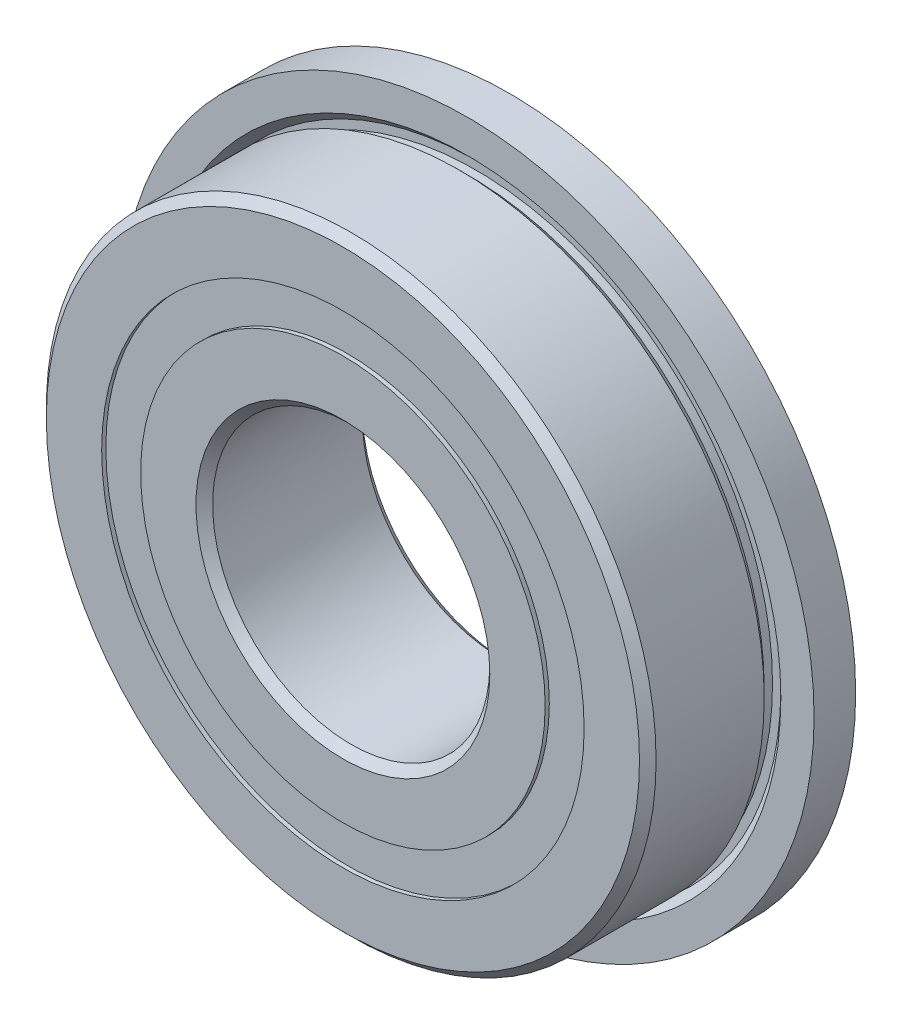
ISO-10303-21;
HEADER;
FILE_DESCRIPTION(('STEP AP214'),'2;1');
FILE_NAME('part.step','',(''),(''),'','','');
FILE_SCHEMA(('AUTOMOTIVE_DESIGN { 1 0 10303 214 1 1 1 1 }'));
ENDSEC;
DATA;
#1=APPLICATION_CONTEXT('core data for automotive mechanical design processes');
#2=APPLICATION_PROTOCOL_DEFINITION('international standard','automotive_design',2000,#1);
#3=PRODUCT_CONTEXT('',#1,'mechanical');
#4=PRODUCT('Part','Part','',(#3));
#5=PRODUCT_RELATED_PRODUCT_CATEGORY('part','',(#4));
#6=PRODUCT_DEFINITION_FORMATION('','',#4);
#7=PRODUCT_DEFINITION_CONTEXT('part definition',#1,'design');
#8=PRODUCT_DEFINITION('design','',#6,#7);
#9=PRODUCT_DEFINITION_SHAPE('','',#8);
#10=(LENGTH_UNIT() NAMED_UNIT(*) SI_UNIT(.MILLI.,.METRE.));
#11=(NAMED_UNIT(*) PLANE_ANGLE_UNIT() SI_UNIT($,.RADIAN.));
#12=(NAMED_UNIT(*) SI_UNIT($,.STERADIAN.) SOLID_ANGLE_UNIT());
#13=UNCERTAINTY_MEASURE_WITH_UNIT(LENGTH_MEASURE(1.E-05),#10,'distance_accuracy_value','');
#14=(GEOMETRIC_REPRESENTATION_CONTEXT(3) GLOBAL_UNCERTAINTY_ASSIGNED_CONTEXT((#13)) GLOBAL_UNIT_ASSIGNED_CONTEXT((#10,
#11,#12)) REPRESENTATION_CONTEXT('',''));
#15=CARTESIAN_POINT('',(0.,0.,0.));
#16=DIRECTION('',(0.,0.,1.));
#17=DIRECTION('',(1.,0.,0.));
#18=AXIS2_PLACEMENT_3D('',#15,#16,#17);
#19=CARTESIAN_POINT('',(0.,8.7032967032967,-2.85000000000001));
#20=DIRECTION('',(0.,0.,1.));
#21=DIRECTION('',(1.,0.,0.));
#22=AXIS2_PLACEMENT_3D('',#19,#20,#21);
#23=PLANE('',#22);
#24=CARTESIAN_POINT('',(0.,0.,-2.85000000000001));
#25=DIRECTION('',(0.,0.,1.));
#26=DIRECTION('',(1.,0.,0.));
#27=AXIS2_PLACEMENT_3D('',#24,#25,#26);
#28=CIRCLE('',#27,8.7032967032967);
#29=CARTESIAN_POINT('',(8.7032967032967,0.,-2.85000000000001));
#30=VERTEX_POINT('',#29);
#31=EDGE_CURVE('E60',#30,#30,#28,.T.);
#32=ORIENTED_EDGE('',*,*,#31,.F.);
#33=EDGE_LOOP('',(#32));
#34=FACE_BOUND('',#33,.T.);
#35=CARTESIAN_POINT('',(0.,0.,-2.85000000000001));
#36=DIRECTION('',(0.,0.,1.));
#37=DIRECTION('',(1.,0.,0.));
#38=AXIS2_PLACEMENT_3D('',#35,#36,#37);
#39=CIRCLE('',#38,7.2967032967033);
#40=CARTESIAN_POINT('',(7.2967032967033,0.,-2.85000000000001));
#41=VERTEX_POINT('',#40);
#42=EDGE_CURVE('E11',#41,#41,#39,.T.);
#43=ORIENTED_EDGE('',*,*,#42,.T.);
#44=EDGE_LOOP('',(#43));
#45=FACE_BOUND('',#44,.T.);
#46=ADVANCED_FACE('F46',(#34,#45),#23,.F.);
#47=CARTESIAN_POINT('',(0.,0.,3.));
#48=DIRECTION('',(0.,0.,1.));
#49=DIRECTION('',(1.,0.,0.));
#50=AXIS2_PLACEMENT_3D('',#47,#48,#49);
#51=CYLINDRICAL_SURFACE('',#50,7.2967032967033);
#52=ORIENTED_EDGE('',*,*,#42,.F.);
#53=EDGE_LOOP('',(#52));
#54=FACE_BOUND('',#53,.T.);
#55=CARTESIAN_POINT('',(0.,0.,-1.50744951180655));
#56=DIRECTION('',(0.,0.,1.));
#57=DIRECTION('',(1.,0.,0.));
#58=AXIS2_PLACEMENT_3D('',#55,#56,#57);
#59=CIRCLE('',#58,7.2967032967033);
#60=CARTESIAN_POINT('',(7.2967032967033,0.,-1.50744951180655));
#61=VERTEX_POINT('',#60);
#62=EDGE_CURVE('E52',#61,#61,#59,.T.);
#63=ORIENTED_EDGE('',*,*,#62,.T.);
#64=EDGE_LOOP('',(#63));
#65=FACE_BOUND('',#64,.T.);
#66=ADVANCED_FACE('F69',(#54,#65),#51,.F.);
#67=CARTESIAN_POINT('',(0.,8.7032967032967,-1.50744951180654));
#68=DIRECTION('',(0.,0.,-1.));
#69=DIRECTION('',(-1.,0.,0.));
#70=AXIS2_PLACEMENT_3D('',#67,#68,#69);
#71=PLANE('',#70);
#72=ORIENTED_EDGE('',*,*,#62,.F.);
#73=EDGE_LOOP('',(#72));
#74=FACE_BOUND('',#73,.T.);
#75=CARTESIAN_POINT('',(0.,0.,-1.50744951180654));
#76=DIRECTION('',(0.,0.,1.));
#77=DIRECTION('',(1.,0.,0.));
#78=AXIS2_PLACEMENT_3D('',#75,#76,#77);
#79=CIRCLE('',#78,8.7032967032967);
#80=CARTESIAN_POINT('',(8.7032967032967,0.,-1.50744951180654));
#81=VERTEX_POINT('',#80);
#82=EDGE_CURVE('E56',#81,#81,#79,.T.);
#83=ORIENTED_EDGE('',*,*,#82,.T.);
#84=EDGE_LOOP('',(#83));
#85=FACE_BOUND('',#84,.T.);
#86=ADVANCED_FACE('F73',(#74,#85),#71,.F.);
#87=CARTESIAN_POINT('',(0.,0.,3.));
#88=DIRECTION('',(0.,0.,1.));
#89=DIRECTION('',(1.,0.,0.));
#90=AXIS2_PLACEMENT_3D('',#87,#88,#89);
#91=CYLINDRICAL_SURFACE('',#90,8.7032967032967);
#92=ORIENTED_EDGE('',*,*,#82,.F.);
#93=EDGE_LOOP('',(#92));
#94=FACE_BOUND('',#93,.T.);
#95=ORIENTED_EDGE('',*,*,#31,.T.);
#96=EDGE_LOOP('',(#95));
#97=FACE_BOUND('',#96,.T.);
#98=ADVANCED_FACE('F66',(#94,#97),#91,.T.);
#99=CLOSED_SHELL('',(#46,#66,#86,#98));
#100=MANIFOLD_SOLID_BREP('B2',#99);
#101=CARTESIAN_POINT('',(0.,8.7032967032967,2.85000000000001));
#102=DIRECTION('',(0.,0.,-1.));
#103=DIRECTION('',(-1.,0.,0.));
#104=AXIS2_PLACEMENT_3D('',#101,#102,#103);
#105=PLANE('',#104);
#106=CARTESIAN_POINT('',(0.,0.,2.85000000000001));
#107=DIRECTION('',(0.,0.,1.));
#108=DIRECTION('',(1.,0.,0.));
#109=AXIS2_PLACEMENT_3D('',#106,#107,#108);
#110=CIRCLE('',#109,7.2967032967033);
#111=CARTESIAN_POINT('',(7.2967032967033,0.,2.85000000000001));
#112=VERTEX_POINT('',#111);
#113=EDGE_CURVE('E45',#112,#112,#110,.T.);
#114=ORIENTED_EDGE('',*,*,#113,.F.);
#115=EDGE_LOOP('',(#114));
#116=FACE_BOUND('',#115,.T.);
#117=CARTESIAN_POINT('',(0.,0.,2.85000000000001));
#118=DIRECTION('',(0.,0.,1.));
#119=DIRECTION('',(1.,0.,0.));
#120=AXIS2_PLACEMENT_3D('',#117,#118,#119);
#121=CIRCLE('',#120,8.7032967032967);
#122=CARTESIAN_POINT('',(8.7032967032967,0.,2.85000000000001));
#123=VERTEX_POINT('',#122);
#124=EDGE_CURVE('E128',#123,#123,#121,.T.);
#125=ORIENTED_EDGE('',*,*,#124,.T.);
#126=EDGE_LOOP('',(#125));
#127=FACE_BOUND('',#126,.T.);
#128=ADVANCED_FACE('F114',(#116,#127),#105,.F.);
#129=CARTESIAN_POINT('',(0.,0.,3.));
#130=DIRECTION('',(0.,0.,1.));
#131=DIRECTION('',(1.,0.,0.));
#132=AXIS2_PLACEMENT_3D('',#129,#130,#131);
#133=CYLINDRICAL_SURFACE('',#132,7.2967032967033);
#134=CARTESIAN_POINT('',(0.,0.,1.50744951180654));
#135=DIRECTION('',(0.,0.,1.));
#136=DIRECTION('',(1.,0.,0.));
#137=AXIS2_PLACEMENT_3D('',#134,#135,#136);
#138=CIRCLE('',#137,7.2967032967033);
#139=CARTESIAN_POINT('',(7.2967032967033,0.,1.50744951180654));
#140=VERTEX_POINT('',#139);
#141=EDGE_CURVE('E120',#140,#140,#138,.T.);
#142=ORIENTED_EDGE('',*,*,#141,.F.);
#143=EDGE_LOOP('',(#142));
#144=FACE_BOUND('',#143,.T.);
#145=ORIENTED_EDGE('',*,*,#113,.T.);
#146=EDGE_LOOP('',(#145));
#147=FACE_BOUND('',#146,.T.);
#148=ADVANCED_FACE('F143',(#144,#147),#133,.F.);
#149=CARTESIAN_POINT('',(0.,8.7032967032967,1.50744951180654));
#150=DIRECTION('',(0.,0.,1.));
#151=DIRECTION('',(1.,0.,0.));
#152=AXIS2_PLACEMENT_3D('',#149,#150,#151);
#153=PLANE('',#152);
#154=CARTESIAN_POINT('',(0.,0.,1.50744951180654));
#155=DIRECTION('',(0.,0.,1.));
#156=DIRECTION('',(1.,0.,0.));
#157=AXIS2_PLACEMENT_3D('',#154,#155,#156);
#158=CIRCLE('',#157,8.7032967032967);
#159=CARTESIAN_POINT('',(8.7032967032967,0.,1.50744951180654));
#160=VERTEX_POINT('',#159);
#161=EDGE_CURVE('E124',#160,#160,#158,.T.);
#162=ORIENTED_EDGE('',*,*,#161,.F.);
#163=EDGE_LOOP('',(#162));
#164=FACE_BOUND('',#163,.T.);
#165=ORIENTED_EDGE('',*,*,#141,.T.);
#166=EDGE_LOOP('',(#165));
#167=FACE_BOUND('',#166,.T.);
#168=ADVANCED_FACE('F138',(#164,#167),#153,.F.);
#169=CARTESIAN_POINT('',(0.,0.,3.));
#170=DIRECTION('',(0.,0.,1.));
#171=DIRECTION('',(1.,0.,0.));
#172=AXIS2_PLACEMENT_3D('',#169,#170,#171);
#173=CYLINDRICAL_SURFACE('',#172,8.7032967032967);
#174=ORIENTED_EDGE('',*,*,#124,.F.);
#175=EDGE_LOOP('',(#174));
#176=FACE_BOUND('',#175,.T.);
#177=ORIENTED_EDGE('',*,*,#161,.T.);
#178=EDGE_LOOP('',(#177));
#179=FACE_BOUND('',#178,.T.);
#180=ADVANCED_FACE('F135',(#176,#179),#173,.T.);
#181=CLOSED_SHELL('',(#128,#148,#168,#180));
#182=MANIFOLD_SOLID_BREP('B6',#181);
#183=CARTESIAN_POINT('',(-4.7022820183397,6.47213595499964,0.));
#184=DIRECTION('',(0.,0.,1.));
#185=DIRECTION('',(-0.587785252292462,0.809016994374955,0.));
#186=AXIS2_PLACEMENT_3D('',#183,#184,#185);
#187=SPHERICAL_SURFACE('',#186,1.50744951180654);
#188=CARTESIAN_POINT('',(-4.7022820183397,6.47213595499964,1.50744951180654));
#189=VERTEX_POINT('',#188);
#190=VERTEX_LOOP('',#189);
#191=FACE_BOUND('',#190,.T.);
#192=ADVANCED_FACE('F182',(#191),#187,.T.);
#193=CLOSED_SHELL('',(#192));
#194=MANIFOLD_SOLID_BREP('B40',#193);
#195=CARTESIAN_POINT('',(-7.6084521303612,2.47213595499967,0.));
#196=DIRECTION('',(0.,0.,1.));
#197=DIRECTION('',(-0.95105651629515,0.309016994374958,0.));
#198=AXIS2_PLACEMENT_3D('',#195,#196,#197);
#199=SPHERICAL_SURFACE('',#198,1.50744951180654);
#200=CARTESIAN_POINT('',(-7.6084521303612,2.47213595499967,1.50744951180654));
#201=VERTEX_POINT('',#200);
#202=VERTEX_LOOP('',#201);
#203=FACE_BOUND('',#202,.T.);
#204=ADVANCED_FACE('F203',(#203),#199,.T.);
#205=CLOSED_SHELL('',(#204));
#206=MANIFOLD_SOLID_BREP('B110',#205);
#207=CARTESIAN_POINT('',(-7.60845213036125,-2.47213595499951,0.));
#208=DIRECTION('',(0.,0.,1.));
#209=DIRECTION('',(-0.951056516295157,-0.309016994374938,0.));
#210=AXIS2_PLACEMENT_3D('',#207,#208,#209);
#211=SPHERICAL_SURFACE('',#210,1.50744951180654);
#212=CARTESIAN_POINT('',(-7.60845213036125,-2.47213595499951,1.50744951180654));
#213=VERTEX_POINT('',#212);
#214=VERTEX_LOOP('',#213);
#215=FACE_BOUND('',#214,.T.);
#216=ADVANCED_FACE('F224',(#215),#211,.T.);
#217=CLOSED_SHELL('',(#216));
#218=MANIFOLD_SOLID_BREP('B178',#217);
#219=CARTESIAN_POINT('',(-4.70228201833984,-6.47213595499954,0.));
#220=DIRECTION('',(0.,0.,1.));
#221=DIRECTION('',(-0.58778525229248,-0.809016994374942,0.));
#222=AXIS2_PLACEMENT_3D('',#219,#220,#221);
#223=SPHERICAL_SURFACE('',#222,1.50744951180654);
#224=CARTESIAN_POINT('',(-4.70228201833984,-6.47213595499954,1.50744951180654));
#225=VERTEX_POINT('',#224);
#226=VERTEX_LOOP('',#225);
#227=FACE_BOUND('',#226,.T.);
#228=ADVANCED_FACE('F245',(#227),#223,.T.);
#229=CLOSED_SHELL('',(#228));
#230=MANIFOLD_SOLID_BREP('B199',#229);
#231=CARTESIAN_POINT('',(0.,-8.,0.));
#232=DIRECTION('',(0.,0.,1.));
#233=DIRECTION('',(0.,-1.,0.));
#234=AXIS2_PLACEMENT_3D('',#231,#232,#233);
#235=SPHERICAL_SURFACE('',#234,1.50744951180654);
#236=CARTESIAN_POINT('',(0.,-8.,1.50744951180654));
#237=VERTEX_POINT('',#236);
#238=VERTEX_LOOP('',#237);
#239=FACE_BOUND('',#238,.T.);
#240=ADVANCED_FACE('F266',(#239),#235,.T.);
#241=CLOSED_SHELL('',(#240));
#242=MANIFOLD_SOLID_BREP('B220',#241);
#243=CARTESIAN_POINT('',(4.70228201833975,-6.47213595499961,0.));
#244=DIRECTION('',(0.,0.,1.));
#245=DIRECTION('',(0.587785252292469,-0.809016994374951,0.));
#246=AXIS2_PLACEMENT_3D('',#243,#244,#245);
#247=SPHERICAL_SURFACE('',#246,1.50744951180654);
#248=CARTESIAN_POINT('',(4.70228201833975,-6.47213595499961,1.50744951180654));
#249=VERTEX_POINT('',#248);
#250=VERTEX_LOOP('',#249);
#251=FACE_BOUND('',#250,.T.);
#252=ADVANCED_FACE('F287',(#251),#247,.T.);
#253=CLOSED_SHELL('',(#252));
#254=MANIFOLD_SOLID_BREP('B241',#253);
#255=CARTESIAN_POINT('',(7.60845213036122,-2.47213595499961,0.));
#256=DIRECTION('',(0.,0.,1.));
#257=DIRECTION('',(0.951056516295152,-0.309016994374952,0.));
#258=AXIS2_PLACEMENT_3D('',#255,#256,#257);
#259=SPHERICAL_SURFACE('',#258,1.50744951180654);
#260=CARTESIAN_POINT('',(7.60845213036122,-2.47213595499961,1.50744951180654));
#261=VERTEX_POINT('',#260);
#262=VERTEX_LOOP('',#261);
#263=FACE_BOUND('',#262,.T.);
#264=ADVANCED_FACE('F308',(#263),#259,.T.);
#265=CLOSED_SHELL('',(#264));
#266=MANIFOLD_SOLID_BREP('B262',#265);
#267=CARTESIAN_POINT('',(7.60845213036124,2.47213595499956,0.));
#268=DIRECTION('',(0.,0.,1.));
#269=DIRECTION('',(0.951056516295155,0.309016994374945,0.));
#270=AXIS2_PLACEMENT_3D('',#267,#268,#269);
#271=SPHERICAL_SURFACE('',#270,1.50744951180654);
#272=CARTESIAN_POINT('',(7.60845213036124,2.47213595499956,1.50744951180654));
#273=VERTEX_POINT('',#272);
#274=VERTEX_LOOP('',#273);
#275=FACE_BOUND('',#274,.T.);
#276=ADVANCED_FACE('F329',(#275),#271,.T.);
#277=CLOSED_SHELL('',(#276));
#278=MANIFOLD_SOLID_BREP('B283',#277);
#279=CARTESIAN_POINT('',(4.70228201833979,6.47213595499957,0.));
#280=DIRECTION('',(0.,0.,1.));
#281=DIRECTION('',(0.587785252292474,0.809016994374947,0.));
#282=AXIS2_PLACEMENT_3D('',#279,#280,#281);
#283=SPHERICAL_SURFACE('',#282,1.50744951180654);
#284=CARTESIAN_POINT('',(4.70228201833979,6.47213595499957,1.50744951180654));
#285=VERTEX_POINT('',#284);
#286=VERTEX_LOOP('',#285);
#287=FACE_BOUND('',#286,.T.);
#288=ADVANCED_FACE('F350',(#287),#283,.T.);
#289=CLOSED_SHELL('',(#288));
#290=MANIFOLD_SOLID_BREP('B304',#289);
#291=CARTESIAN_POINT('',(0.,8.,0.));
#292=DIRECTION('',(0.,0.,1.));
#293=DIRECTION('',(0.,1.,0.));
#294=AXIS2_PLACEMENT_3D('',#291,#292,#293);
#295=SPHERICAL_SURFACE('',#294,1.50744951180654);
#296=CARTESIAN_POINT('',(0.,8.,1.50744951180654));
#297=VERTEX_POINT('',#296);
#298=VERTEX_LOOP('',#297);
#299=FACE_BOUND('',#298,.T.);
#300=ADVANCED_FACE('F373',(#299),#295,.T.);
#301=CLOSED_SHELL('',(#300));
#302=MANIFOLD_SOLID_BREP('B325',#301);
#303=CARTESIAN_POINT('',(0.,8.35164835164835,0.117216117216116));
#304=DIRECTION('',(0.,0.,-1.));
#305=DIRECTION('',(-1.,0.,0.));
#306=AXIS2_PLACEMENT_3D('',#303,#304,#305);
#307=PLANE('',#306);
#308=CARTESIAN_POINT('',(0.,0.,0.117216117216116));
#309=DIRECTION('',(0.,0.,1.));
#310=DIRECTION('',(1.,0.,0.));
#311=AXIS2_PLACEMENT_3D('',#308,#309,#310);
#312=CIRCLE('',#311,7.64835164835165);
#313=CARTESIAN_POINT('',(7.64835164835165,0.,0.117216117216116));
#314=VERTEX_POINT('',#313);
#315=EDGE_CURVE('E372',#314,#314,#312,.T.);
#316=ORIENTED_EDGE('',*,*,#315,.F.);
#317=EDGE_LOOP('',(#316));
#318=FACE_BOUND('',#317,.T.);
#319=CARTESIAN_POINT('',(0.,0.,0.117216117216116));
#320=DIRECTION('',(0.,0.,1.));
#321=DIRECTION('',(1.,0.,0.));
#322=AXIS2_PLACEMENT_3D('',#319,#320,#321);
#323=CIRCLE('',#322,8.35164835164835);
#324=CARTESIAN_POINT('',(8.35164835164835,0.,0.117216117216116));
#325=VERTEX_POINT('',#324);
#326=EDGE_CURVE('E408',#325,#325,#323,.T.);
#327=ORIENTED_EDGE('',*,*,#326,.T.);
#328=EDGE_LOOP('',(#327));
#329=FACE_BOUND('',#328,.T.);
#330=ADVANCED_FACE('F394',(#318,#329),#307,.F.);
#331=CARTESIAN_POINT('',(0.,0.,3.));
#332=DIRECTION('',(0.,0.,1.));
#333=DIRECTION('',(1.,0.,0.));
#334=AXIS2_PLACEMENT_3D('',#331,#332,#333);
#335=CYLINDRICAL_SURFACE('',#334,7.64835164835165);
#336=CARTESIAN_POINT('',(0.,0.,-0.117216117216118));
#337=DIRECTION('',(0.,0.,1.));
#338=DIRECTION('',(1.,0.,0.));
#339=AXIS2_PLACEMENT_3D('',#336,#337,#338);
#340=CIRCLE('',#339,7.64835164835165);
#341=CARTESIAN_POINT('',(7.64835164835165,0.,-0.117216117216118));
#342=VERTEX_POINT('',#341);
#343=EDGE_CURVE('E400',#342,#342,#340,.T.);
#344=ORIENTED_EDGE('',*,*,#343,.F.);
#345=EDGE_LOOP('',(#344));
#346=FACE_BOUND('',#345,.T.);
#347=ORIENTED_EDGE('',*,*,#315,.T.);
#348=EDGE_LOOP('',(#347));
#349=FACE_BOUND('',#348,.T.);
#350=ADVANCED_FACE('F423',(#346,#349),#335,.F.);
#351=CARTESIAN_POINT('',(0.,8.35164835164835,-0.117216117216118));
#352=DIRECTION('',(0.,0.,1.));
#353=DIRECTION('',(1.,0.,0.));
#354=AXIS2_PLACEMENT_3D('',#351,#352,#353);
#355=PLANE('',#354);
#356=CARTESIAN_POINT('',(0.,0.,-0.117216117216118));
#357=DIRECTION('',(0.,0.,1.));
#358=DIRECTION('',(1.,0.,0.));
#359=AXIS2_PLACEMENT_3D('',#356,#357,#358);
#360=CIRCLE('',#359,8.35164835164835);
#361=CARTESIAN_POINT('',(8.35164835164835,0.,-0.117216117216118));
#362=VERTEX_POINT('',#361);
#363=EDGE_CURVE('E404',#362,#362,#360,.T.);
#364=ORIENTED_EDGE('',*,*,#363,.F.);
#365=EDGE_LOOP('',(#364));
#366=FACE_BOUND('',#365,.T.);
#367=ORIENTED_EDGE('',*,*,#343,.T.);
#368=EDGE_LOOP('',(#367));
#369=FACE_BOUND('',#368,.T.);
#370=ADVANCED_FACE('F418',(#366,#369),#355,.F.);
#371=CARTESIAN_POINT('',(0.,0.,3.));
#372=DIRECTION('',(0.,0.,1.));
#373=DIRECTION('',(1.,0.,0.));
#374=AXIS2_PLACEMENT_3D('',#371,#372,#373);
#375=CYLINDRICAL_SURFACE('',#374,8.35164835164835);
#376=ORIENTED_EDGE('',*,*,#326,.F.);
#377=EDGE_LOOP('',(#376));
#378=FACE_BOUND('',#377,.T.);
#379=ORIENTED_EDGE('',*,*,#363,.T.);
#380=EDGE_LOOP('',(#379));
#381=FACE_BOUND('',#380,.T.);
#382=ADVANCED_FACE('F415',(#378,#381),#375,.T.);
#383=CLOSED_SHELL('',(#330,#350,#370,#382));
#384=MANIFOLD_SOLID_BREP('B346',#383);
#385=CARTESIAN_POINT('',(0.,7.2967032967033,3.));
#386=DIRECTION('',(0.,0.,-1.));
#387=DIRECTION('',(-1.,0.,0.));
#388=AXIS2_PLACEMENT_3D('',#385,#386,#387);
#389=PLANE('',#388);
#390=CARTESIAN_POINT('',(0.,0.,3.));
#391=DIRECTION('',(0.,0.,1.));
#392=DIRECTION('',(1.,0.,0.));
#393=AXIS2_PLACEMENT_3D('',#390,#391,#392);
#394=CIRCLE('',#393,5.29999999999998);
#395=CARTESIAN_POINT('',(5.29999999999998,0.,3.));
#396=VERTEX_POINT('',#395);
#397=EDGE_CURVE('E491',#396,#396,#394,.T.);
#398=ORIENTED_EDGE('',*,*,#397,.F.);
#399=EDGE_LOOP('',(#398));
#400=FACE_BOUND('',#399,.T.);
#401=CARTESIAN_POINT('',(0.,0.,3.));
#402=DIRECTION('',(0.,0.,1.));
#403=DIRECTION('',(1.,0.,0.));
#404=AXIS2_PLACEMENT_3D('',#401,#402,#403);
#405=CIRCLE('',#404,7.2967032967033);
#406=CARTESIAN_POINT('',(7.2967032967033,0.,3.));
#407=VERTEX_POINT('',#406);
#408=EDGE_CURVE('E393',#407,#407,#405,.T.);
#409=ORIENTED_EDGE('',*,*,#408,.T.);
#410=EDGE_LOOP('',(#409));
#411=FACE_BOUND('',#410,.T.);
#412=ADVANCED_FACE('F463',(#400,#411),#389,.F.);
#413=CARTESIAN_POINT('',(0.,0.,3.));
#414=DIRECTION('',(0.,0.,1.));
#415=DIRECTION('',(1.,0.,0.));
#416=AXIS2_PLACEMENT_3D('',#413,#414,#415);
#417=CYLINDRICAL_SURFACE('',#416,7.2967032967033);
#418=ORIENTED_EDGE('',*,*,#408,.F.);
#419=EDGE_LOOP('',(#418));
#420=FACE_BOUND('',#419,.T.);
#421=CARTESIAN_POINT('',(0.,0.,1.33333333333333));
#422=DIRECTION('',(0.,0.,1.));
#423=DIRECTION('',(1.,0.,0.));
#424=AXIS2_PLACEMENT_3D('',#421,#422,#423);
#425=CIRCLE('',#424,7.2967032967033);
#426=CARTESIAN_POINT('',(7.2967032967033,0.,1.33333333333333));
#427=VERTEX_POINT('',#426);
#428=EDGE_CURVE('E469',#427,#427,#425,.T.);
#429=ORIENTED_EDGE('',*,*,#428,.T.);
#430=EDGE_LOOP('',(#429));
#431=FACE_BOUND('',#430,.T.);
#432=ADVANCED_FACE('F498',(#420,#431),#417,.T.);
#433=CARTESIAN_POINT('',(0.,0.,0.));
#434=DIRECTION('',(0.,0.,1.));
#435=DIRECTION('',(1.,0.,0.));
#436=AXIS2_PLACEMENT_3D('',#433,#434,#435);
#437=TOROIDAL_SURFACE('',#436,8.,1.50744951180654);
#438=ORIENTED_EDGE('',*,*,#428,.F.);
#439=EDGE_LOOP('',(#438));
#440=FACE_BOUND('',#439,.T.);
#441=CARTESIAN_POINT('',(0.,0.,-1.33333333333333));
#442=DIRECTION('',(0.,0.,1.));
#443=DIRECTION('',(1.,0.,0.));
#444=AXIS2_PLACEMENT_3D('',#441,#442,#443);
#445=CIRCLE('',#444,7.2967032967033);
#446=CARTESIAN_POINT('',(7.2967032967033,0.,-1.33333333333333));
#447=VERTEX_POINT('',#446);
#448=EDGE_CURVE('E473',#447,#447,#445,.T.);
#449=ORIENTED_EDGE('',*,*,#448,.T.);
#450=EDGE_LOOP('',(#449));
#451=FACE_BOUND('',#450,.T.);
#452=ADVANCED_FACE('F502',(#440,#451),#437,.F.);
#453=CARTESIAN_POINT('',(0.,0.,3.));
#454=DIRECTION('',(0.,0.,1.));
#455=DIRECTION('',(1.,0.,0.));
#456=AXIS2_PLACEMENT_3D('',#453,#454,#455);
#457=CYLINDRICAL_SURFACE('',#456,7.2967032967033);
#458=ORIENTED_EDGE('',*,*,#448,.F.);
#459=EDGE_LOOP('',(#458));
#460=FACE_BOUND('',#459,.T.);
#461=CARTESIAN_POINT('',(0.,0.,-3.));
#462=DIRECTION('',(0.,0.,1.));
#463=DIRECTION('',(1.,0.,0.));
#464=AXIS2_PLACEMENT_3D('',#461,#462,#463);
#465=CIRCLE('',#464,7.2967032967033);
#466=CARTESIAN_POINT('',(7.2967032967033,0.,-3.));
#467=VERTEX_POINT('',#466);
#468=EDGE_CURVE('E477',#467,#467,#465,.T.);
#469=ORIENTED_EDGE('',*,*,#468,.T.);
#470=EDGE_LOOP('',(#469));
#471=FACE_BOUND('',#470,.T.);
#472=ADVANCED_FACE('F507',(#460,#471),#457,.T.);
#473=CARTESIAN_POINT('',(0.,5.29999999999998,-3.));
#474=DIRECTION('',(0.,0.,1.));
#475=DIRECTION('',(1.,0.,0.));
#476=AXIS2_PLACEMENT_3D('',#473,#474,#475);
#477=PLANE('',#476);
#478=ORIENTED_EDGE('',*,*,#468,.F.);
#479=EDGE_LOOP('',(#478));
#480=FACE_BOUND('',#479,.T.);
#481=CARTESIAN_POINT('',(0.,0.,-3.));
#482=DIRECTION('',(0.,0.,1.));
#483=DIRECTION('',(1.,0.,0.));
#484=AXIS2_PLACEMENT_3D('',#481,#482,#483);
#485=CIRCLE('',#484,5.29999999999998);
#486=CARTESIAN_POINT('',(5.29999999999998,0.,-3.));
#487=VERTEX_POINT('',#486);
#488=EDGE_CURVE('E482',#487,#487,#485,.T.);
#489=ORIENTED_EDGE('',*,*,#488,.T.);
#490=EDGE_LOOP('',(#489));
#491=FACE_BOUND('',#490,.T.);
#492=ADVANCED_FACE('F513',(#480,#491),#477,.F.);
#493=CARTESIAN_POINT('',(0.,0.,-2.70000000000002));
#494=DIRECTION('',(0.,0.,-1.));
#495=DIRECTION('',(-1.,0.,0.));
#496=AXIS2_PLACEMENT_3D('',#493,#494,#495);
#497=CONICAL_SURFACE('',#496,5.,0.785398163397453);
#498=ORIENTED_EDGE('',*,*,#488,.F.);
#499=EDGE_LOOP('',(#498));
#500=FACE_BOUND('',#499,.T.);
#501=CARTESIAN_POINT('',(0.,0.,-2.70000000000002));
#502=DIRECTION('',(0.,0.,1.));
#503=DIRECTION('',(1.,0.,0.));
#504=AXIS2_PLACEMENT_3D('',#501,#502,#503);
#505=CIRCLE('',#504,5.);
#506=CARTESIAN_POINT('',(5.,0.,-2.70000000000002));
#507=VERTEX_POINT('',#506);
#508=EDGE_CURVE('E485',#507,#507,#505,.T.);
#509=ORIENTED_EDGE('',*,*,#508,.T.);
#510=EDGE_LOOP('',(#509));
#511=FACE_BOUND('',#510,.T.);
#512=ADVANCED_FACE('F517',(#500,#511),#497,.F.);
#513=CARTESIAN_POINT('',(0.,0.,3.));
#514=DIRECTION('',(0.,0.,1.));
#515=DIRECTION('',(1.,0.,0.));
#516=AXIS2_PLACEMENT_3D('',#513,#514,#515);
#517=CYLINDRICAL_SURFACE('',#516,5.);
#518=ORIENTED_EDGE('',*,*,#508,.F.);
#519=EDGE_LOOP('',(#518));
#520=FACE_BOUND('',#519,.T.);
#521=CARTESIAN_POINT('',(0.,0.,2.70000000000002));
#522=DIRECTION('',(0.,0.,1.));
#523=DIRECTION('',(1.,0.,0.));
#524=AXIS2_PLACEMENT_3D('',#521,#522,#523);
#525=CIRCLE('',#524,5.);
#526=CARTESIAN_POINT('',(5.,0.,2.70000000000002));
#527=VERTEX_POINT('',#526);
#528=EDGE_CURVE('E488',#527,#527,#525,.T.);
#529=ORIENTED_EDGE('',*,*,#528,.T.);
#530=EDGE_LOOP('',(#529));
#531=FACE_BOUND('',#530,.T.);
#532=ADVANCED_FACE('F521',(#520,#531),#517,.F.);
#533=CARTESIAN_POINT('',(0.,0.,3.));
#534=DIRECTION('',(0.,0.,1.));
#535=DIRECTION('',(1.,0.,0.));
#536=AXIS2_PLACEMENT_3D('',#533,#534,#535);
#537=CONICAL_SURFACE('',#536,5.29999999999998,0.785398163397445);
#538=ORIENTED_EDGE('',*,*,#528,.F.);
#539=EDGE_LOOP('',(#538));
#540=FACE_BOUND('',#539,.T.);
#541=ORIENTED_EDGE('',*,*,#397,.T.);
#542=EDGE_LOOP('',(#541));
#543=FACE_BOUND('',#542,.T.);
#544=ADVANCED_FACE('F495',(#540,#543),#537,.F.);
#545=CLOSED_SHELL('',(#412,#432,#452,#472,#492,#512,#532,#544));
#546=MANIFOLD_SOLID_BREP('B367',#545);
#547=CARTESIAN_POINT('',(0.,0.,3.));
#548=DIRECTION('',(0.,0.,1.));
#549=DIRECTION('',(1.,0.,0.));
#550=AXIS2_PLACEMENT_3D('',#547,#548,#549);
#551=CYLINDRICAL_SURFACE('',#550,12.5);
#552=CARTESIAN_POINT('',(0.,0.,-1.5));
#553=DIRECTION('',(0.,0.,1.));
#554=DIRECTION('',(1.,0.,0.));
#555=AXIS2_PLACEMENT_3D('',#552,#553,#554);
#556=CIRCLE('',#555,12.5);
#557=CARTESIAN_POINT('',(12.5,0.,-1.5));
#558=VERTEX_POINT('',#557);
#559=EDGE_CURVE('E591',#558,#558,#556,.T.);
#560=ORIENTED_EDGE('',*,*,#559,.F.);
#561=EDGE_LOOP('',(#560));
#562=FACE_BOUND('',#561,.T.);
#563=CARTESIAN_POINT('',(0.,0.,-2.99999999999999));
#564=DIRECTION('',(0.,0.,1.));
#565=DIRECTION('',(1.,0.,0.));
#566=AXIS2_PLACEMENT_3D('',#563,#564,#565);
#567=CIRCLE('',#566,12.5);
#568=CARTESIAN_POINT('',(12.5,0.,-2.99999999999999));
#569=VERTEX_POINT('',#568);
#570=EDGE_CURVE('E462',#569,#569,#567,.T.);
#571=ORIENTED_EDGE('',*,*,#570,.T.);
#572=EDGE_LOOP('',(#571));
#573=FACE_BOUND('',#572,.T.);
#574=ADVANCED_FACE('F585',(#562,#573),#551,.T.);
#575=CARTESIAN_POINT('',(0.,12.5,-1.5));
#576=DIRECTION('',(0.,0.,-1.));
#577=DIRECTION('',(-1.,0.,0.));
#578=AXIS2_PLACEMENT_3D('',#575,#576,#577);
#579=PLANE('',#578);
#580=CARTESIAN_POINT('',(0.,0.,-1.5));
#581=DIRECTION('',(0.,0.,1.));
#582=DIRECTION('',(1.,0.,0.));
#583=AXIS2_PLACEMENT_3D('',#580,#581,#582);
#584=CIRCLE('',#583,11.3);
#585=CARTESIAN_POINT('',(11.3,0.,-1.5));
#586=VERTEX_POINT('',#585);
#587=EDGE_CURVE('E595',#586,#586,#584,.T.);
#588=ORIENTED_EDGE('',*,*,#587,.F.);
#589=EDGE_LOOP('',(#588));
#590=FACE_BOUND('',#589,.T.);
#591=ORIENTED_EDGE('',*,*,#559,.T.);
#592=EDGE_LOOP('',(#591));
#593=FACE_BOUND('',#592,.T.);
#594=ADVANCED_FACE('F691',(#590,#593),#579,.F.);
#595=CARTESIAN_POINT('',(0.,0.,-1.5));
#596=DIRECTION('',(0.,0.,1.));
#597=DIRECTION('',(1.,0.,0.));
#598=AXIS2_PLACEMENT_3D('',#595,#596,#597);
#599=CONICAL_SURFACE('',#598,11.3,0.785398163397437);
#600=CARTESIAN_POINT('',(0.,0.,-1.79999999999998));
#601=DIRECTION('',(0.,0.,1.));
#602=DIRECTION('',(1.,0.,0.));
#603=AXIS2_PLACEMENT_3D('',#600,#601,#602);
#604=CIRCLE('',#603,11.);
#605=CARTESIAN_POINT('',(11.,0.,-1.79999999999998));
#606=VERTEX_POINT('',#605);
#607=EDGE_CURVE('E599',#606,#606,#604,.T.);
#608=ORIENTED_EDGE('',*,*,#607,.F.);
#609=EDGE_LOOP('',(#608));
#610=FACE_BOUND('',#609,.T.);
#611=ORIENTED_EDGE('',*,*,#587,.T.);
#612=EDGE_LOOP('',(#611));
#613=FACE_BOUND('',#612,.T.);
#614=ADVANCED_FACE('F685',(#610,#613),#599,.F.);
#615=CARTESIAN_POINT('',(0.,11.,-1.79999999999998));
#616=DIRECTION('',(0.,0.,-1.));
#617=DIRECTION('',(-1.,0.,0.));
#618=AXIS2_PLACEMENT_3D('',#615,#616,#617);
#619=PLANE('',#618);
#620=CARTESIAN_POINT('',(0.,0.,-1.79999999999998));
#621=DIRECTION('',(0.,0.,1.));
#622=DIRECTION('',(1.,0.,0.));
#623=AXIS2_PLACEMENT_3D('',#620,#621,#622);
#624=CIRCLE('',#623,10.7);
#625=CARTESIAN_POINT('',(10.7,0.,-1.79999999999998));
#626=VERTEX_POINT('',#625);
#627=EDGE_CURVE('E604',#626,#626,#624,.T.);
#628=ORIENTED_EDGE('',*,*,#627,.F.);
#629=EDGE_LOOP('',(#628));
#630=FACE_BOUND('',#629,.T.);
#631=ORIENTED_EDGE('',*,*,#607,.T.);
#632=EDGE_LOOP('',(#631));
#633=FACE_BOUND('',#632,.T.);
#634=ADVANCED_FACE('F679',(#630,#633),#619,.F.);
#635=CARTESIAN_POINT('',(0.,0.,3.));
#636=DIRECTION('',(0.,0.,1.));
#637=DIRECTION('',(1.,0.,0.));
#638=AXIS2_PLACEMENT_3D('',#635,#636,#637);
#639=CYLINDRICAL_SURFACE('',#638,10.7);
#640=CARTESIAN_POINT('',(0.,0.,-1.5));
#641=DIRECTION('',(0.,0.,1.));
#642=DIRECTION('',(1.,0.,0.));
#643=AXIS2_PLACEMENT_3D('',#640,#641,#642);
#644=CIRCLE('',#643,10.7);
#645=CARTESIAN_POINT('',(10.7,0.,-1.5));
#646=VERTEX_POINT('',#645);
#647=EDGE_CURVE('E607',#646,#646,#644,.T.);
#648=ORIENTED_EDGE('',*,*,#647,.F.);
#649=EDGE_LOOP('',(#648));
#650=FACE_BOUND('',#649,.T.);
#651=ORIENTED_EDGE('',*,*,#627,.T.);
#652=EDGE_LOOP('',(#651));
#653=FACE_BOUND('',#652,.T.);
#654=ADVANCED_FACE('F673',(#650,#653),#639,.T.);
#655=CARTESIAN_POINT('',(0.,0.,-1.5));
#656=DIRECTION('',(0.,0.,1.));
#657=DIRECTION('',(1.,0.,0.));
#658=AXIS2_PLACEMENT_3D('',#655,#656,#657);
#659=CONICAL_SURFACE('',#658,10.7,0.785398163397447);
#660=CARTESIAN_POINT('',(0.,0.,-1.20000000000002));
#661=DIRECTION('',(0.,0.,1.));
#662=DIRECTION('',(1.,0.,0.));
#663=AXIS2_PLACEMENT_3D('',#660,#661,#662);
#664=CIRCLE('',#663,11.);
#665=CARTESIAN_POINT('',(11.,0.,-1.20000000000002));
#666=VERTEX_POINT('',#665);
#667=EDGE_CURVE('E610',#666,#666,#664,.T.);
#668=ORIENTED_EDGE('',*,*,#667,.F.);
#669=EDGE_LOOP('',(#668));
#670=FACE_BOUND('',#669,.T.);
#671=ORIENTED_EDGE('',*,*,#647,.T.);
#672=EDGE_LOOP('',(#671));
#673=FACE_BOUND('',#672,.T.);
#674=ADVANCED_FACE('F667',(#670,#673),#659,.T.);
#675=CARTESIAN_POINT('',(0.,0.,3.));
#676=DIRECTION('',(0.,0.,1.));
#677=DIRECTION('',(1.,0.,0.));
#678=AXIS2_PLACEMENT_3D('',#675,#676,#677);
#679=CYLINDRICAL_SURFACE('',#678,11.);
#680=CARTESIAN_POINT('',(0.,0.,2.70000000000002));
#681=DIRECTION('',(0.,0.,1.));
#682=DIRECTION('',(1.,0.,0.));
#683=AXIS2_PLACEMENT_3D('',#680,#681,#682);
#684=CIRCLE('',#683,11.);
#685=CARTESIAN_POINT('',(11.,0.,2.70000000000002));
#686=VERTEX_POINT('',#685);
#687=EDGE_CURVE('E613',#686,#686,#684,.T.);
#688=ORIENTED_EDGE('',*,*,#687,.F.);
#689=EDGE_LOOP('',(#688));
#690=FACE_BOUND('',#689,.T.);
#691=ORIENTED_EDGE('',*,*,#667,.T.);
#692=EDGE_LOOP('',(#691));
#693=FACE_BOUND('',#692,.T.);
#694=ADVANCED_FACE('F661',(#690,#693),#679,.T.);
#695=CARTESIAN_POINT('',(0.,0.,2.70000000000002));
#696=DIRECTION('',(0.,0.,-1.));
#697=DIRECTION('',(-1.,0.,0.));
#698=AXIS2_PLACEMENT_3D('',#695,#696,#697);
#699=CONICAL_SURFACE('',#698,11.,0.785398163397453);
#700=CARTESIAN_POINT('',(0.,0.,3.));
#701=DIRECTION('',(0.,0.,1.));
#702=DIRECTION('',(1.,0.,0.));
#703=AXIS2_PLACEMENT_3D('',#700,#701,#702);
#704=CIRCLE('',#703,10.7);
#705=CARTESIAN_POINT('',(10.7,0.,3.));
#706=VERTEX_POINT('',#705);
#707=EDGE_CURVE('E616',#706,#706,#704,.T.);
#708=ORIENTED_EDGE('',*,*,#707,.F.);
#709=EDGE_LOOP('',(#708));
#710=FACE_BOUND('',#709,.T.);
#711=ORIENTED_EDGE('',*,*,#687,.T.);
#712=EDGE_LOOP('',(#711));
#713=FACE_BOUND('',#712,.T.);
#714=ADVANCED_FACE('F655',(#710,#713),#699,.T.);
#715=CARTESIAN_POINT('',(0.,10.7,3.));
#716=DIRECTION('',(0.,0.,-1.));
#717=DIRECTION('',(-1.,0.,0.));
#718=AXIS2_PLACEMENT_3D('',#715,#716,#717);
#719=PLANE('',#718);
#720=CARTESIAN_POINT('',(0.,0.,3.));
#721=DIRECTION('',(0.,0.,1.));
#722=DIRECTION('',(1.,0.,0.));
#723=AXIS2_PLACEMENT_3D('',#720,#721,#722);
#724=CIRCLE('',#723,8.7032967032967);
#725=CARTESIAN_POINT('',(8.7032967032967,0.,3.));
#726=VERTEX_POINT('',#725);
#727=EDGE_CURVE('E619',#726,#726,#724,.T.);
#728=ORIENTED_EDGE('',*,*,#727,.F.);
#729=EDGE_LOOP('',(#728));
#730=FACE_BOUND('',#729,.T.);
#731=ORIENTED_EDGE('',*,*,#707,.T.);
#732=EDGE_LOOP('',(#731));
#733=FACE_BOUND('',#732,.T.);
#734=ADVANCED_FACE('F649',(#730,#733),#719,.F.);
#735=CARTESIAN_POINT('',(0.,0.,3.));
#736=DIRECTION('',(0.,0.,1.));
#737=DIRECTION('',(1.,0.,0.));
#738=AXIS2_PLACEMENT_3D('',#735,#736,#737);
#739=CYLINDRICAL_SURFACE('',#738,8.7032967032967);
#740=CARTESIAN_POINT('',(0.,0.,1.33333333333333));
#741=DIRECTION('',(0.,0.,1.));
#742=DIRECTION('',(1.,0.,0.));
#743=AXIS2_PLACEMENT_3D('',#740,#741,#742);
#744=CIRCLE('',#743,8.7032967032967);
#745=CARTESIAN_POINT('',(8.7032967032967,0.,1.33333333333333));
#746=VERTEX_POINT('',#745);
#747=EDGE_CURVE('E622',#746,#746,#744,.T.);
#748=ORIENTED_EDGE('',*,*,#747,.F.);
#749=EDGE_LOOP('',(#748));
#750=FACE_BOUND('',#749,.T.);
#751=ORIENTED_EDGE('',*,*,#727,.T.);
#752=EDGE_LOOP('',(#751));
#753=FACE_BOUND('',#752,.T.);
#754=ADVANCED_FACE('F643',(#750,#753),#739,.F.);
#755=CARTESIAN_POINT('',(0.,0.,0.));
#756=DIRECTION('',(0.,0.,1.));
#757=DIRECTION('',(1.,0.,0.));
#758=AXIS2_PLACEMENT_3D('',#755,#756,#757);
#759=TOROIDAL_SURFACE('',#758,8.,1.50744951180654);
#760=CARTESIAN_POINT('',(0.,0.,-1.33333333333333));
#761=DIRECTION('',(0.,0.,1.));
#762=DIRECTION('',(1.,0.,0.));
#763=AXIS2_PLACEMENT_3D('',#760,#761,#762);
#764=CIRCLE('',#763,8.7032967032967);
#765=CARTESIAN_POINT('',(8.7032967032967,0.,-1.33333333333333));
#766=VERTEX_POINT('',#765);
#767=EDGE_CURVE('E625',#766,#766,#764,.T.);
#768=ORIENTED_EDGE('',*,*,#767,.F.);
#769=EDGE_LOOP('',(#768));
#770=FACE_BOUND('',#769,.T.);
#771=ORIENTED_EDGE('',*,*,#747,.T.);
#772=EDGE_LOOP('',(#771));
#773=FACE_BOUND('',#772,.T.);
#774=ADVANCED_FACE('F637',(#770,#773),#759,.F.);
#775=CARTESIAN_POINT('',(0.,0.,3.));
#776=DIRECTION('',(0.,0.,1.));
#777=DIRECTION('',(1.,0.,0.));
#778=AXIS2_PLACEMENT_3D('',#775,#776,#777);
#779=CYLINDRICAL_SURFACE('',#778,8.7032967032967);
#780=CARTESIAN_POINT('',(0.,0.,-3.));
#781=DIRECTION('',(0.,0.,1.));
#782=DIRECTION('',(1.,0.,0.));
#783=AXIS2_PLACEMENT_3D('',#780,#781,#782);
#784=CIRCLE('',#783,8.7032967032967);
#785=CARTESIAN_POINT('',(8.7032967032967,0.,-3.));
#786=VERTEX_POINT('',#785);
#787=EDGE_CURVE('E628',#786,#786,#784,.T.);
#788=ORIENTED_EDGE('',*,*,#787,.F.);
#789=EDGE_LOOP('',(#788));
#790=FACE_BOUND('',#789,.T.);
#791=ORIENTED_EDGE('',*,*,#767,.T.);
#792=EDGE_LOOP('',(#791));
#793=FACE_BOUND('',#792,.T.);
#794=ADVANCED_FACE('F634',(#790,#793),#779,.F.);
#795=CARTESIAN_POINT('',(0.,8.7032967032967,-3.));
#796=DIRECTION('',(0.,0.,1.));
#797=DIRECTION('',(1.,0.,0.));
#798=AXIS2_PLACEMENT_3D('',#795,#796,#797);
#799=PLANE('',#798);
#800=ORIENTED_EDGE('',*,*,#570,.F.);
#801=EDGE_LOOP('',(#800));
#802=FACE_BOUND('',#801,.T.);
#803=ORIENTED_EDGE('',*,*,#787,.T.);
#804=EDGE_LOOP('',(#803));
#805=FACE_BOUND('',#804,.T.);
#806=ADVANCED_FACE('F632',(#802,#805),#799,.F.);
#807=CLOSED_SHELL('',(#574,#594,#614,#634,#654,#674,#694,#714,#734,#754,#774,#794,#806));
#808=MANIFOLD_SOLID_BREP('B388',#807);
#809=ADVANCED_BREP_SHAPE_REPRESENTATION('',(#18,#100,#182,#194,#206,#218,#230,#242,#254,#266,
#278,#290,#302,#384,#546,#808),#14);
#810=SHAPE_DEFINITION_REPRESENTATION(#9,#809);
ENDSEC;
END-ISO-10303-21;
